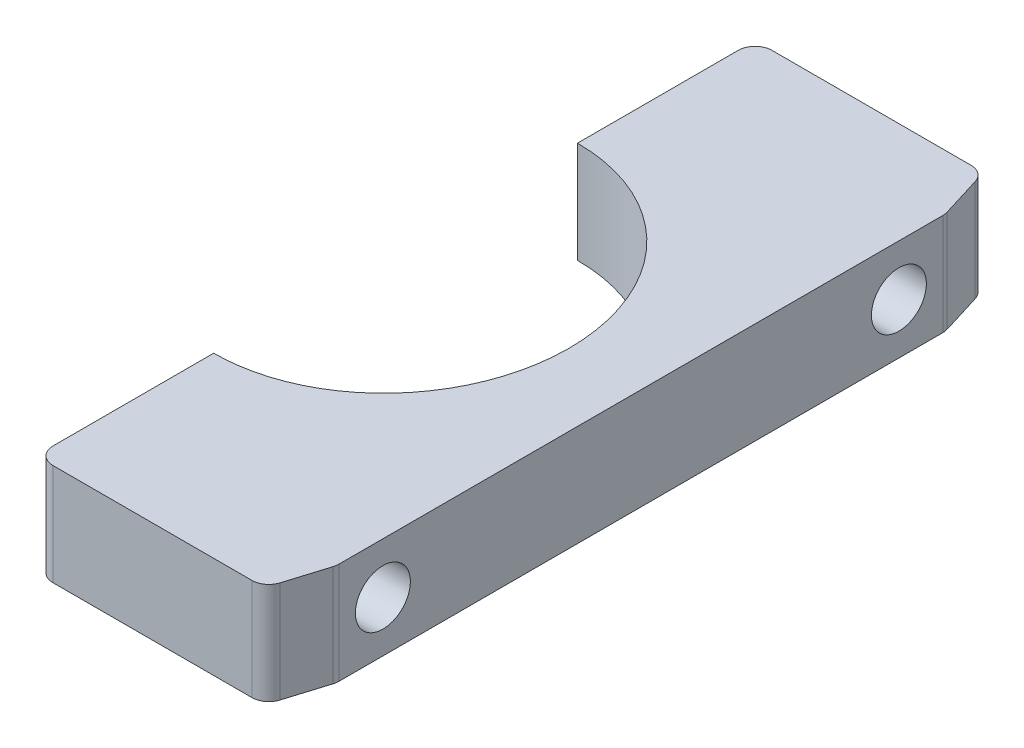
ISO-10303-21;
HEADER;
FILE_DESCRIPTION(('STEP AP214'),'2;1');
FILE_NAME('part.step','',(''),(''),'','','');
FILE_SCHEMA(('AUTOMOTIVE_DESIGN { 1 0 10303 214 1 1 1 1 }'));
ENDSEC;
DATA;
#1=APPLICATION_CONTEXT('core data for automotive mechanical design processes');
#2=APPLICATION_PROTOCOL_DEFINITION('international standard','automotive_design',2000,#1);
#3=PRODUCT_CONTEXT('',#1,'mechanical');
#4=PRODUCT('Part','Part','',(#3));
#5=PRODUCT_RELATED_PRODUCT_CATEGORY('part','',(#4));
#6=PRODUCT_DEFINITION_FORMATION('','',#4);
#7=PRODUCT_DEFINITION_CONTEXT('part definition',#1,'design');
#8=PRODUCT_DEFINITION('design','',#6,#7);
#9=PRODUCT_DEFINITION_SHAPE('','',#8);
#10=(LENGTH_UNIT() NAMED_UNIT(*) SI_UNIT(.MILLI.,.METRE.));
#11=(NAMED_UNIT(*) PLANE_ANGLE_UNIT() SI_UNIT($,.RADIAN.));
#12=(NAMED_UNIT(*) SI_UNIT($,.STERADIAN.) SOLID_ANGLE_UNIT());
#13=UNCERTAINTY_MEASURE_WITH_UNIT(LENGTH_MEASURE(1.E-05),#10,'distance_accuracy_value','');
#14=(GEOMETRIC_REPRESENTATION_CONTEXT(3) GLOBAL_UNCERTAINTY_ASSIGNED_CONTEXT((#13)) GLOBAL_UNIT_ASSIGNED_CONTEXT((#10,
#11,#12)) REPRESENTATION_CONTEXT('',''));
#15=CARTESIAN_POINT('',(0.,0.,0.));
#16=DIRECTION('',(0.,0.,1.));
#17=DIRECTION('',(1.,0.,0.));
#18=AXIS2_PLACEMENT_3D('',#15,#16,#17);
#19=CARTESIAN_POINT('',(0.,12.,0.));
#20=DIRECTION('',(0.,-1.,0.));
#21=DIRECTION('',(0.,0.,-1.));
#22=AXIS2_PLACEMENT_3D('',#19,#20,#21);
#23=ELLIPSE('',#22,21.5,20.5);
#24=DIRECTION('',(0.,-1.,0.));
#25=VECTOR('',#24,1.);
#26=SURFACE_OF_LINEAR_EXTRUSION('',#23,#25);
#27=CARTESIAN_POINT('',(0.,0.,0.));
#28=DIRECTION('',(0.,-1.,0.));
#29=DIRECTION('',(0.,0.,-1.));
#30=AXIS2_PLACEMENT_3D('',#27,#28,#29);
#31=ELLIPSE('',#30,21.5,20.5);
#32=CARTESIAN_POINT('',(0.,0.,-21.5));
#33=VERTEX_POINT('',#32);
#34=CARTESIAN_POINT('',(0.,0.,21.5));
#35=VERTEX_POINT('',#34);
#36=EDGE_CURVE('E152',#33,#35,#31,.T.);
#37=ORIENTED_EDGE('',*,*,#36,.T.);
#38=DIRECTION('',(0.,-1.,0.));
#39=VECTOR('',#38,1.);
#40=CARTESIAN_POINT('',(0.,12.,21.5));
#41=LINE('',#40,#39);
#42=CARTESIAN_POINT('',(0.,12.,21.5));
#43=VERTEX_POINT('',#42);
#44=EDGE_CURVE('E136',#43,#35,#41,.T.);
#45=ORIENTED_EDGE('',*,*,#44,.F.);
#46=CARTESIAN_POINT('',(0.,12.,-21.5));
#47=VERTEX_POINT('',#46);
#48=EDGE_CURVE('E139',#47,#43,#23,.T.);
#49=ORIENTED_EDGE('',*,*,#48,.F.);
#50=DIRECTION('',(0.,-1.,0.));
#51=VECTOR('',#50,1.);
#52=CARTESIAN_POINT('',(0.,12.,-21.5));
#53=LINE('',#52,#51);
#54=EDGE_CURVE('E154',#47,#33,#53,.T.);
#55=ORIENTED_EDGE('',*,*,#54,.T.);
#56=EDGE_LOOP('',(#37,#45,#49,#55));
#57=FACE_BOUND('',#56,.T.);
#58=ADVANCED_FACE('F33',(#57),#26,.F.);
#59=CARTESIAN_POINT('',(0.,12.,21.5));
#60=DIRECTION('',(1.,0.,0.));
#61=DIRECTION('',(0.,0.,-1.));
#62=AXIS2_PLACEMENT_3D('',#59,#60,#61);
#63=PLANE('',#62);
#64=CARTESIAN_POINT('',(0.,6.,30.5));
#65=DIRECTION('',(1.,0.,0.));
#66=DIRECTION('',(0.,0.,1.));
#67=AXIS2_PLACEMENT_3D('',#64,#65,#66);
#68=CIRCLE('',#67,3.25);
#69=CARTESIAN_POINT('',(0.,6.,33.75));
#70=VERTEX_POINT('',#69);
#71=EDGE_CURVE('E342',#70,#70,#68,.T.);
#72=ORIENTED_EDGE('',*,*,#71,.T.);
#73=EDGE_LOOP('',(#72));
#74=FACE_BOUND('',#73,.T.);
#75=DIRECTION('',(0.,0.,1.));
#76=VECTOR('',#75,1.);
#77=CARTESIAN_POINT('',(0.,0.,21.5));
#78=LINE('',#77,#76);
#79=CARTESIAN_POINT('',(0.,0.,40.5));
#80=VERTEX_POINT('',#79);
#81=EDGE_CURVE('E247',#35,#80,#78,.T.);
#82=ORIENTED_EDGE('',*,*,#81,.T.);
#83=DIRECTION('',(0.,-1.,0.));
#84=VECTOR('',#83,1.);
#85=CARTESIAN_POINT('',(0.,12.,40.5));
#86=LINE('',#85,#84);
#87=CARTESIAN_POINT('',(0.,12.,40.5));
#88=VERTEX_POINT('',#87);
#89=EDGE_CURVE('E56',#80,#88,#86,.F.);
#90=ORIENTED_EDGE('',*,*,#89,.T.);
#91=DIRECTION('',(0.,0.,1.));
#92=VECTOR('',#91,1.);
#93=CARTESIAN_POINT('',(0.,12.,21.5));
#94=LINE('',#93,#92);
#95=EDGE_CURVE('E132',#43,#88,#94,.T.);
#96=ORIENTED_EDGE('',*,*,#95,.F.);
#97=ORIENTED_EDGE('',*,*,#44,.T.);
#98=EDGE_LOOP('',(#82,#90,#96,#97));
#99=FACE_BOUND('',#98,.T.);
#100=ADVANCED_FACE('F134',(#74,#99),#63,.F.);
#101=CARTESIAN_POINT('',(0.,12.,42.5));
#102=DIRECTION('',(0.,0.,-1.));
#103=DIRECTION('',(-1.,0.,0.));
#104=AXIS2_PLACEMENT_3D('',#101,#102,#103);
#105=PLANE('',#104);
#106=DIRECTION('',(1.,0.,0.));
#107=VECTOR('',#106,1.);
#108=CARTESIAN_POINT('',(0.,12.,42.5));
#109=LINE('',#108,#107);
#110=CARTESIAN_POINT('',(2.,12.,42.5));
#111=VERTEX_POINT('',#110);
#112=CARTESIAN_POINT('',(25.5228506909638,12.,42.5));
#113=VERTEX_POINT('',#112);
#114=EDGE_CURVE('E138',#111,#113,#109,.T.);
#115=ORIENTED_EDGE('',*,*,#114,.F.);
#116=DIRECTION('',(0.,-1.,0.));
#117=VECTOR('',#116,1.);
#118=CARTESIAN_POINT('',(2.,12.,42.5));
#119=LINE('',#118,#117);
#120=CARTESIAN_POINT('',(2.,0.,42.5));
#121=VERTEX_POINT('',#120);
#122=EDGE_CURVE('E201',#111,#121,#119,.T.);
#123=ORIENTED_EDGE('',*,*,#122,.T.);
#124=DIRECTION('',(1.,0.,0.));
#125=VECTOR('',#124,1.);
#126=CARTESIAN_POINT('',(0.,0.,42.5));
#127=LINE('',#126,#125);
#128=CARTESIAN_POINT('',(25.5228506909638,0.,42.5));
#129=VERTEX_POINT('',#128);
#130=EDGE_CURVE('E245',#121,#129,#127,.T.);
#131=ORIENTED_EDGE('',*,*,#130,.T.);
#132=DIRECTION('',(0.,-1.,0.));
#133=VECTOR('',#132,1.);
#134=CARTESIAN_POINT('',(25.5228506909638,12.,42.5));
#135=LINE('',#134,#133);
#136=EDGE_CURVE('E175',#129,#113,#135,.F.);
#137=ORIENTED_EDGE('',*,*,#136,.T.);
#138=EDGE_LOOP('',(#115,#123,#131,#137));
#139=FACE_BOUND('',#138,.T.);
#140=ADVANCED_FACE('F310',(#139),#105,.F.);
#141=CARTESIAN_POINT('',(27.,12.,42.5));
#142=DIRECTION('',(-0.95577900872195,0.,-0.294085848837524));
#143=DIRECTION('',(-0.294085848837524,0.,0.95577900872195));
#144=AXIS2_PLACEMENT_3D('',#141,#142,#143);
#145=PLANE('',#144);
#146=DIRECTION('',(0.294085848837524,0.,-0.95577900872195));
#147=VECTOR('',#146,1.);
#148=CARTESIAN_POINT('',(27.,0.,42.5));
#149=LINE('',#148,#147);
#150=CARTESIAN_POINT('',(27.4344087084077,0.,41.0881716976751));
#151=VERTEX_POINT('',#150);
#152=CARTESIAN_POINT('',(28.9115580174439,0.,36.2874364433073));
#153=VERTEX_POINT('',#152);
#154=EDGE_CURVE('E242',#151,#153,#149,.T.);
#155=ORIENTED_EDGE('',*,*,#154,.T.);
#156=DIRECTION('',(0.,-1.,0.));
#157=VECTOR('',#156,1.);
#158=CARTESIAN_POINT('',(28.9115580174439,12.,36.2874364433073));
#159=LINE('',#158,#157);
#160=CARTESIAN_POINT('',(28.9115580174439,12.,36.2874364433073));
#161=VERTEX_POINT('',#160);
#162=EDGE_CURVE('E169',#153,#161,#159,.F.);
#163=ORIENTED_EDGE('',*,*,#162,.T.);
#164=DIRECTION('',(0.294085848837524,0.,-0.95577900872195));
#165=VECTOR('',#164,1.);
#166=CARTESIAN_POINT('',(27.,12.,42.5));
#167=LINE('',#166,#165);
#168=CARTESIAN_POINT('',(27.4344087084077,12.,41.0881716976751));
#169=VERTEX_POINT('',#168);
#170=EDGE_CURVE('E254',#169,#161,#167,.T.);
#171=ORIENTED_EDGE('',*,*,#170,.F.);
#172=DIRECTION('',(0.,-1.,0.));
#173=VECTOR('',#172,1.);
#174=CARTESIAN_POINT('',(27.4344087084077,12.,41.0881716976751));
#175=LINE('',#174,#173);
#176=EDGE_CURVE('E166',#169,#151,#175,.T.);
#177=ORIENTED_EDGE('',*,*,#176,.T.);
#178=EDGE_LOOP('',(#155,#163,#171,#177));
#179=FACE_BOUND('',#178,.T.);
#180=ADVANCED_FACE('F303',(#179),#145,.F.);
#181=CARTESIAN_POINT('',(29.,12.,-36.));
#182=DIRECTION('',(-1.,0.,0.));
#183=DIRECTION('',(0.,0.,1.));
#184=AXIS2_PLACEMENT_3D('',#181,#182,#183);
#185=PLANE('',#184);
#186=CARTESIAN_POINT('',(29.,6.,-30.5));
#187=DIRECTION('',(1.,0.,0.));
#188=DIRECTION('',(0.,0.,-1.));
#189=AXIS2_PLACEMENT_3D('',#186,#187,#188);
#190=CIRCLE('',#189,3.25);
#191=CARTESIAN_POINT('',(29.,6.,-33.75));
#192=VERTEX_POINT('',#191);
#193=EDGE_CURVE('E346',#192,#192,#190,.T.);
#194=ORIENTED_EDGE('',*,*,#193,.F.);
#195=EDGE_LOOP('',(#194));
#196=FACE_BOUND('',#195,.T.);
#197=CARTESIAN_POINT('',(29.,6.,30.5));
#198=DIRECTION('',(1.,0.,0.));
#199=DIRECTION('',(0.,0.,1.));
#200=AXIS2_PLACEMENT_3D('',#197,#198,#199);
#201=CIRCLE('',#200,3.25);
#202=CARTESIAN_POINT('',(29.,6.,33.75));
#203=VERTEX_POINT('',#202);
#204=EDGE_CURVE('E259',#203,#203,#201,.T.);
#205=ORIENTED_EDGE('',*,*,#204,.F.);
#206=EDGE_LOOP('',(#205));
#207=FACE_BOUND('',#206,.T.);
#208=DIRECTION('',(0.,0.,-1.));
#209=VECTOR('',#208,1.);
#210=CARTESIAN_POINT('',(29.,0.,-36.));
#211=LINE('',#210,#209);
#212=CARTESIAN_POINT('',(29.,0.,35.6992647456323));
#213=VERTEX_POINT('',#212);
#214=CARTESIAN_POINT('',(29.,0.,-35.6992647456323));
#215=VERTEX_POINT('',#214);
#216=EDGE_CURVE('E237',#213,#215,#211,.T.);
#217=ORIENTED_EDGE('',*,*,#216,.T.);
#218=DIRECTION('',(0.,-1.,0.));
#219=VECTOR('',#218,1.);
#220=CARTESIAN_POINT('',(29.,12.,-35.6992647456323));
#221=LINE('',#220,#219);
#222=CARTESIAN_POINT('',(29.,12.,-35.6992647456323));
#223=VERTEX_POINT('',#222);
#224=EDGE_CURVE('E11',#215,#223,#221,.F.);
#225=ORIENTED_EDGE('',*,*,#224,.T.);
#226=DIRECTION('',(0.,0.,-1.));
#227=VECTOR('',#226,1.);
#228=CARTESIAN_POINT('',(29.,12.,-36.));
#229=LINE('',#228,#227);
#230=CARTESIAN_POINT('',(29.,12.,35.6992647456323));
#231=VERTEX_POINT('',#230);
#232=EDGE_CURVE('E223',#231,#223,#229,.T.);
#233=ORIENTED_EDGE('',*,*,#232,.F.);
#234=DIRECTION('',(0.,-1.,0.));
#235=VECTOR('',#234,1.);
#236=CARTESIAN_POINT('',(29.,12.,35.6992647456323));
#237=LINE('',#236,#235);
#238=EDGE_CURVE('E153',#231,#213,#237,.T.);
#239=ORIENTED_EDGE('',*,*,#238,.T.);
#240=EDGE_LOOP('',(#217,#225,#233,#239));
#241=FACE_BOUND('',#240,.T.);
#242=ADVANCED_FACE('F296',(#196,#207,#241),#185,.F.);
#243=CARTESIAN_POINT('',(27.,12.,-42.5));
#244=DIRECTION('',(-0.95577900872195,0.,0.294085848837524));
#245=DIRECTION('',(0.294085848837524,0.,0.95577900872195));
#246=AXIS2_PLACEMENT_3D('',#243,#244,#245);
#247=PLANE('',#246);
#248=DIRECTION('',(-0.294085848837524,0.,-0.95577900872195));
#249=VECTOR('',#248,1.);
#250=CARTESIAN_POINT('',(27.,0.,-42.5));
#251=LINE('',#250,#249);
#252=CARTESIAN_POINT('',(28.9115580174439,0.,-36.2874364433073));
#253=VERTEX_POINT('',#252);
#254=CARTESIAN_POINT('',(27.4344087084077,0.,-41.0881716976751));
#255=VERTEX_POINT('',#254);
#256=EDGE_CURVE('E216',#253,#255,#251,.T.);
#257=ORIENTED_EDGE('',*,*,#256,.T.);
#258=DIRECTION('',(0.,-1.,0.));
#259=VECTOR('',#258,1.);
#260=CARTESIAN_POINT('',(27.4344087084077,12.,-41.0881716976751));
#261=LINE('',#260,#259);
#262=CARTESIAN_POINT('',(27.4344087084077,12.,-41.0881716976751));
#263=VERTEX_POINT('',#262);
#264=EDGE_CURVE('E41',#255,#263,#261,.F.);
#265=ORIENTED_EDGE('',*,*,#264,.T.);
#266=DIRECTION('',(-0.294085848837524,0.,-0.95577900872195));
#267=VECTOR('',#266,1.);
#268=CARTESIAN_POINT('',(27.,12.,-42.5));
#269=LINE('',#268,#267);
#270=CARTESIAN_POINT('',(28.9115580174439,12.,-36.2874364433073));
#271=VERTEX_POINT('',#270);
#272=EDGE_CURVE('E213',#271,#263,#269,.T.);
#273=ORIENTED_EDGE('',*,*,#272,.F.);
#274=DIRECTION('',(0.,-1.,0.));
#275=VECTOR('',#274,1.);
#276=CARTESIAN_POINT('',(28.9115580174439,12.,-36.2874364433073));
#277=LINE('',#276,#275);
#278=EDGE_CURVE('E205',#271,#253,#277,.T.);
#279=ORIENTED_EDGE('',*,*,#278,.T.);
#280=EDGE_LOOP('',(#257,#265,#273,#279));
#281=FACE_BOUND('',#280,.T.);
#282=ADVANCED_FACE('F212',(#281),#247,.F.);
#283=CARTESIAN_POINT('',(0.,12.,-42.5));
#284=DIRECTION('',(0.,0.,1.));
#285=DIRECTION('',(1.,0.,0.));
#286=AXIS2_PLACEMENT_3D('',#283,#284,#285);
#287=PLANE('',#286);
#288=DIRECTION('',(-1.,0.,0.));
#289=VECTOR('',#288,1.);
#290=CARTESIAN_POINT('',(0.,0.,-42.5));
#291=LINE('',#290,#289);
#292=CARTESIAN_POINT('',(25.5228506909638,0.,-42.5));
#293=VERTEX_POINT('',#292);
#294=CARTESIAN_POINT('',(2.,0.,-42.5));
#295=VERTEX_POINT('',#294);
#296=EDGE_CURVE('E231',#293,#295,#291,.T.);
#297=ORIENTED_EDGE('',*,*,#296,.T.);
#298=DIRECTION('',(0.,-1.,0.));
#299=VECTOR('',#298,1.);
#300=CARTESIAN_POINT('',(2.,12.,-42.5));
#301=LINE('',#300,#299);
#302=CARTESIAN_POINT('',(2.,12.,-42.5));
#303=VERTEX_POINT('',#302);
#304=EDGE_CURVE('E192',#295,#303,#301,.F.);
#305=ORIENTED_EDGE('',*,*,#304,.T.);
#306=DIRECTION('',(-1.,0.,0.));
#307=VECTOR('',#306,1.);
#308=CARTESIAN_POINT('',(0.,12.,-42.5));
#309=LINE('',#308,#307);
#310=CARTESIAN_POINT('',(25.5228506909638,12.,-42.5));
#311=VERTEX_POINT('',#310);
#312=EDGE_CURVE('E222',#311,#303,#309,.T.);
#313=ORIENTED_EDGE('',*,*,#312,.F.);
#314=DIRECTION('',(0.,-1.,0.));
#315=VECTOR('',#314,1.);
#316=CARTESIAN_POINT('',(25.5228506909638,12.,-42.5));
#317=LINE('',#316,#315);
#318=EDGE_CURVE('E189',#311,#293,#317,.T.);
#319=ORIENTED_EDGE('',*,*,#318,.T.);
#320=EDGE_LOOP('',(#297,#305,#313,#319));
#321=FACE_BOUND('',#320,.T.);
#322=ADVANCED_FACE('F230',(#321),#287,.F.);
#323=CARTESIAN_POINT('',(0.,12.,-21.5));
#324=DIRECTION('',(1.,0.,0.));
#325=DIRECTION('',(0.,0.,-1.));
#326=AXIS2_PLACEMENT_3D('',#323,#324,#325);
#327=PLANE('',#326);
#328=CARTESIAN_POINT('',(0.,6.,-30.5));
#329=DIRECTION('',(1.,0.,0.));
#330=DIRECTION('',(0.,0.,-1.));
#331=AXIS2_PLACEMENT_3D('',#328,#329,#330);
#332=CIRCLE('',#331,3.25);
#333=CARTESIAN_POINT('',(0.,6.,-33.75));
#334=VERTEX_POINT('',#333);
#335=EDGE_CURVE('E250',#334,#334,#332,.T.);
#336=ORIENTED_EDGE('',*,*,#335,.T.);
#337=EDGE_LOOP('',(#336));
#338=FACE_BOUND('',#337,.T.);
#339=DIRECTION('',(0.,0.,1.));
#340=VECTOR('',#339,1.);
#341=CARTESIAN_POINT('',(0.,12.,-21.5));
#342=LINE('',#341,#340);
#343=CARTESIAN_POINT('',(0.,12.,-40.5));
#344=VERTEX_POINT('',#343);
#345=EDGE_CURVE('E145',#344,#47,#342,.T.);
#346=ORIENTED_EDGE('',*,*,#345,.F.);
#347=DIRECTION('',(0.,-1.,0.));
#348=VECTOR('',#347,1.);
#349=CARTESIAN_POINT('',(0.,12.,-40.5));
#350=LINE('',#349,#348);
#351=CARTESIAN_POINT('',(0.,0.,-40.5));
#352=VERTEX_POINT('',#351);
#353=EDGE_CURVE('E178',#344,#352,#350,.T.);
#354=ORIENTED_EDGE('',*,*,#353,.T.);
#355=DIRECTION('',(0.,0.,1.));
#356=VECTOR('',#355,1.);
#357=CARTESIAN_POINT('',(0.,0.,-21.5));
#358=LINE('',#357,#356);
#359=EDGE_CURVE('E149',#352,#33,#358,.T.);
#360=ORIENTED_EDGE('',*,*,#359,.T.);
#361=ORIENTED_EDGE('',*,*,#54,.F.);
#362=EDGE_LOOP('',(#346,#354,#360,#361));
#363=FACE_BOUND('',#362,.T.);
#364=ADVANCED_FACE('F327',(#338,#363),#327,.F.);
#365=CARTESIAN_POINT('',(0.,12.,0.));
#366=DIRECTION('',(0.,1.,0.));
#367=DIRECTION('',(0.,0.,1.));
#368=AXIS2_PLACEMENT_3D('',#365,#366,#367);
#369=PLANE('',#368);
#370=ORIENTED_EDGE('',*,*,#312,.T.);
#371=CARTESIAN_POINT('',(2.,12.,-40.5));
#372=DIRECTION('',(0.,1.,0.));
#373=DIRECTION('',(0.,0.,1.));
#374=AXIS2_PLACEMENT_3D('',#371,#372,#373);
#375=CIRCLE('',#374,2.);
#376=EDGE_CURVE('E199',#303,#344,#375,.T.);
#377=ORIENTED_EDGE('',*,*,#376,.T.);
#378=ORIENTED_EDGE('',*,*,#345,.T.);
#379=ORIENTED_EDGE('',*,*,#48,.T.);
#380=ORIENTED_EDGE('',*,*,#95,.T.);
#381=CARTESIAN_POINT('',(2.,12.,40.5));
#382=DIRECTION('',(0.,1.,0.));
#383=DIRECTION('',(0.,0.,1.));
#384=AXIS2_PLACEMENT_3D('',#381,#382,#383);
#385=CIRCLE('',#384,2.);
#386=EDGE_CURVE('E48',#88,#111,#385,.T.);
#387=ORIENTED_EDGE('',*,*,#386,.T.);
#388=ORIENTED_EDGE('',*,*,#114,.T.);
#389=CARTESIAN_POINT('',(25.5228506909638,12.,40.5));
#390=DIRECTION('',(0.,1.,0.));
#391=DIRECTION('',(0.,0.,1.));
#392=AXIS2_PLACEMENT_3D('',#389,#390,#391);
#393=CIRCLE('',#392,2.);
#394=EDGE_CURVE('E171',#113,#169,#393,.T.);
#395=ORIENTED_EDGE('',*,*,#394,.T.);
#396=ORIENTED_EDGE('',*,*,#170,.T.);
#397=CARTESIAN_POINT('',(27.,12.,35.6992647456323));
#398=DIRECTION('',(0.,1.,0.));
#399=DIRECTION('',(0.,0.,1.));
#400=AXIS2_PLACEMENT_3D('',#397,#398,#399);
#401=CIRCLE('',#400,2.);
#402=EDGE_CURVE('E173',#161,#231,#401,.T.);
#403=ORIENTED_EDGE('',*,*,#402,.T.);
#404=ORIENTED_EDGE('',*,*,#232,.T.);
#405=CARTESIAN_POINT('',(27.,12.,-35.6992647456323));
#406=DIRECTION('',(0.,1.,0.));
#407=DIRECTION('',(0.,0.,1.));
#408=AXIS2_PLACEMENT_3D('',#405,#406,#407);
#409=CIRCLE('',#408,2.);
#410=EDGE_CURVE('E194',#223,#271,#409,.T.);
#411=ORIENTED_EDGE('',*,*,#410,.T.);
#412=ORIENTED_EDGE('',*,*,#272,.T.);
#413=CARTESIAN_POINT('',(25.5228506909638,12.,-40.5));
#414=DIRECTION('',(0.,1.,0.));
#415=DIRECTION('',(0.,0.,1.));
#416=AXIS2_PLACEMENT_3D('',#413,#414,#415);
#417=CIRCLE('',#416,2.);
#418=EDGE_CURVE('E196',#263,#311,#417,.T.);
#419=ORIENTED_EDGE('',*,*,#418,.T.);
#420=EDGE_LOOP('',(#370,#377,#378,#379,#380,#387,#388,#395,#396,#403,#404,#411,#412,#419));
#421=FACE_BOUND('',#420,.T.);
#422=ADVANCED_FACE('F143',(#421),#369,.T.);
#423=CARTESIAN_POINT('',(0.,0.,0.));
#424=DIRECTION('',(0.,1.,0.));
#425=DIRECTION('',(0.,0.,1.));
#426=AXIS2_PLACEMENT_3D('',#423,#424,#425);
#427=PLANE('',#426);
#428=ORIENTED_EDGE('',*,*,#359,.F.);
#429=CARTESIAN_POINT('',(2.,0.,-40.5));
#430=DIRECTION('',(0.,1.,0.));
#431=DIRECTION('',(0.,0.,1.));
#432=AXIS2_PLACEMENT_3D('',#429,#430,#431);
#433=CIRCLE('',#432,2.);
#434=EDGE_CURVE('E187',#352,#295,#433,.F.);
#435=ORIENTED_EDGE('',*,*,#434,.T.);
#436=ORIENTED_EDGE('',*,*,#296,.F.);
#437=CARTESIAN_POINT('',(25.5228506909638,0.,-40.5));
#438=DIRECTION('',(0.,1.,0.));
#439=DIRECTION('',(0.,0.,1.));
#440=AXIS2_PLACEMENT_3D('',#437,#438,#439);
#441=CIRCLE('',#440,2.);
#442=EDGE_CURVE('E183',#293,#255,#441,.F.);
#443=ORIENTED_EDGE('',*,*,#442,.T.);
#444=ORIENTED_EDGE('',*,*,#256,.F.);
#445=CARTESIAN_POINT('',(27.,0.,-35.6992647456323));
#446=DIRECTION('',(0.,1.,0.));
#447=DIRECTION('',(0.,0.,1.));
#448=AXIS2_PLACEMENT_3D('',#445,#446,#447);
#449=CIRCLE('',#448,2.);
#450=EDGE_CURVE('E181',#253,#215,#449,.F.);
#451=ORIENTED_EDGE('',*,*,#450,.T.);
#452=ORIENTED_EDGE('',*,*,#216,.F.);
#453=CARTESIAN_POINT('',(27.,0.,35.6992647456323));
#454=DIRECTION('',(0.,1.,0.));
#455=DIRECTION('',(0.,0.,1.));
#456=AXIS2_PLACEMENT_3D('',#453,#454,#455);
#457=CIRCLE('',#456,2.);
#458=EDGE_CURVE('E164',#213,#153,#457,.F.);
#459=ORIENTED_EDGE('',*,*,#458,.T.);
#460=ORIENTED_EDGE('',*,*,#154,.F.);
#461=CARTESIAN_POINT('',(25.5228506909638,0.,40.5));
#462=DIRECTION('',(0.,1.,0.));
#463=DIRECTION('',(0.,0.,1.));
#464=AXIS2_PLACEMENT_3D('',#461,#462,#463);
#465=CIRCLE('',#464,2.);
#466=EDGE_CURVE('E157',#151,#129,#465,.F.);
#467=ORIENTED_EDGE('',*,*,#466,.T.);
#468=ORIENTED_EDGE('',*,*,#130,.F.);
#469=CARTESIAN_POINT('',(2.,0.,40.5));
#470=DIRECTION('',(0.,1.,0.));
#471=DIRECTION('',(0.,0.,1.));
#472=AXIS2_PLACEMENT_3D('',#469,#470,#471);
#473=CIRCLE('',#472,2.);
#474=EDGE_CURVE('E185',#121,#80,#473,.F.);
#475=ORIENTED_EDGE('',*,*,#474,.T.);
#476=ORIENTED_EDGE('',*,*,#81,.F.);
#477=ORIENTED_EDGE('',*,*,#36,.F.);
#478=EDGE_LOOP('',(#428,#435,#436,#443,#444,#451,#452,#459,#460,#467,#468,#475,#476,#477));
#479=FACE_BOUND('',#478,.T.);
#480=ADVANCED_FACE('F235',(#479),#427,.F.);
#481=CARTESIAN_POINT('',(27.,12.,35.6992647456323));
#482=DIRECTION('',(0.,-1.,0.));
#483=DIRECTION('',(0.,0.,-1.));
#484=AXIS2_PLACEMENT_3D('',#481,#482,#483);
#485=CYLINDRICAL_SURFACE('',#484,2.);
#486=ORIENTED_EDGE('',*,*,#402,.F.);
#487=ORIENTED_EDGE('',*,*,#162,.F.);
#488=ORIENTED_EDGE('',*,*,#458,.F.);
#489=ORIENTED_EDGE('',*,*,#238,.F.);
#490=EDGE_LOOP('',(#486,#487,#488,#489));
#491=FACE_BOUND('',#490,.T.);
#492=ADVANCED_FACE('F266',(#491),#485,.T.);
#493=CARTESIAN_POINT('',(25.5228506909638,12.,40.5));
#494=DIRECTION('',(0.,-1.,0.));
#495=DIRECTION('',(0.,0.,-1.));
#496=AXIS2_PLACEMENT_3D('',#493,#494,#495);
#497=CYLINDRICAL_SURFACE('',#496,2.);
#498=ORIENTED_EDGE('',*,*,#394,.F.);
#499=ORIENTED_EDGE('',*,*,#136,.F.);
#500=ORIENTED_EDGE('',*,*,#466,.F.);
#501=ORIENTED_EDGE('',*,*,#176,.F.);
#502=EDGE_LOOP('',(#498,#499,#500,#501));
#503=FACE_BOUND('',#502,.T.);
#504=ADVANCED_FACE('F269',(#503),#497,.T.);
#505=CARTESIAN_POINT('',(2.,12.,-40.5));
#506=DIRECTION('',(0.,-1.,0.));
#507=DIRECTION('',(0.,0.,-1.));
#508=AXIS2_PLACEMENT_3D('',#505,#506,#507);
#509=CYLINDRICAL_SURFACE('',#508,2.);
#510=ORIENTED_EDGE('',*,*,#376,.F.);
#511=ORIENTED_EDGE('',*,*,#304,.F.);
#512=ORIENTED_EDGE('',*,*,#434,.F.);
#513=ORIENTED_EDGE('',*,*,#353,.F.);
#514=EDGE_LOOP('',(#510,#511,#512,#513));
#515=FACE_BOUND('',#514,.T.);
#516=ADVANCED_FACE('F273',(#515),#509,.T.);
#517=CARTESIAN_POINT('',(2.,12.,40.5));
#518=DIRECTION('',(0.,-1.,0.));
#519=DIRECTION('',(0.,0.,-1.));
#520=AXIS2_PLACEMENT_3D('',#517,#518,#519);
#521=CYLINDRICAL_SURFACE('',#520,2.);
#522=ORIENTED_EDGE('',*,*,#386,.F.);
#523=ORIENTED_EDGE('',*,*,#89,.F.);
#524=ORIENTED_EDGE('',*,*,#474,.F.);
#525=ORIENTED_EDGE('',*,*,#122,.F.);
#526=EDGE_LOOP('',(#522,#523,#524,#525));
#527=FACE_BOUND('',#526,.T.);
#528=ADVANCED_FACE('F277',(#527),#521,.T.);
#529=CARTESIAN_POINT('',(25.5228506909638,12.,-40.5));
#530=DIRECTION('',(0.,-1.,0.));
#531=DIRECTION('',(0.,0.,-1.));
#532=AXIS2_PLACEMENT_3D('',#529,#530,#531);
#533=CYLINDRICAL_SURFACE('',#532,2.);
#534=ORIENTED_EDGE('',*,*,#418,.F.);
#535=ORIENTED_EDGE('',*,*,#264,.F.);
#536=ORIENTED_EDGE('',*,*,#442,.F.);
#537=ORIENTED_EDGE('',*,*,#318,.F.);
#538=EDGE_LOOP('',(#534,#535,#536,#537));
#539=FACE_BOUND('',#538,.T.);
#540=ADVANCED_FACE('F226',(#539),#533,.T.);
#541=CARTESIAN_POINT('',(27.,12.,-35.6992647456323));
#542=DIRECTION('',(0.,-1.,0.));
#543=DIRECTION('',(0.,0.,-1.));
#544=AXIS2_PLACEMENT_3D('',#541,#542,#543);
#545=CYLINDRICAL_SURFACE('',#544,2.);
#546=ORIENTED_EDGE('',*,*,#410,.F.);
#547=ORIENTED_EDGE('',*,*,#224,.F.);
#548=ORIENTED_EDGE('',*,*,#450,.F.);
#549=ORIENTED_EDGE('',*,*,#278,.F.);
#550=EDGE_LOOP('',(#546,#547,#548,#549));
#551=FACE_BOUND('',#550,.T.);
#552=ADVANCED_FACE('F35',(#551),#545,.T.);
#553=CARTESIAN_POINT('',(0.,6.,-30.5));
#554=DIRECTION('',(1.,0.,0.));
#555=DIRECTION('',(0.,0.,-1.));
#556=AXIS2_PLACEMENT_3D('',#553,#554,#555);
#557=CYLINDRICAL_SURFACE('',#556,3.25);
#558=ORIENTED_EDGE('',*,*,#335,.F.);
#559=EDGE_LOOP('',(#558));
#560=FACE_BOUND('',#559,.T.);
#561=ORIENTED_EDGE('',*,*,#193,.T.);
#562=EDGE_LOOP('',(#561));
#563=FACE_BOUND('',#562,.T.);
#564=ADVANCED_FACE('F285',(#560,#563),#557,.F.);
#565=CARTESIAN_POINT('',(0.,6.,30.5));
#566=DIRECTION('',(1.,0.,0.));
#567=DIRECTION('',(0.,0.,-1.));
#568=AXIS2_PLACEMENT_3D('',#565,#566,#567);
#569=CYLINDRICAL_SURFACE('',#568,3.25);
#570=ORIENTED_EDGE('',*,*,#71,.F.);
#571=EDGE_LOOP('',(#570));
#572=FACE_BOUND('',#571,.T.);
#573=ORIENTED_EDGE('',*,*,#204,.T.);
#574=EDGE_LOOP('',(#573));
#575=FACE_BOUND('',#574,.T.);
#576=ADVANCED_FACE('F290',(#572,#575),#569,.F.);
#577=CLOSED_SHELL('',(#58,#100,#140,#180,#242,#282,#322,#364,#422,#480,#492,#504,#516,#528,#540,
#552,#564,#576));
#578=MANIFOLD_SOLID_BREP('B2',#577);
#579=ADVANCED_BREP_SHAPE_REPRESENTATION('',(#18,#578),#14);
#580=SHAPE_DEFINITION_REPRESENTATION(#9,#579);
ENDSEC;
END-ISO-10303-21;
